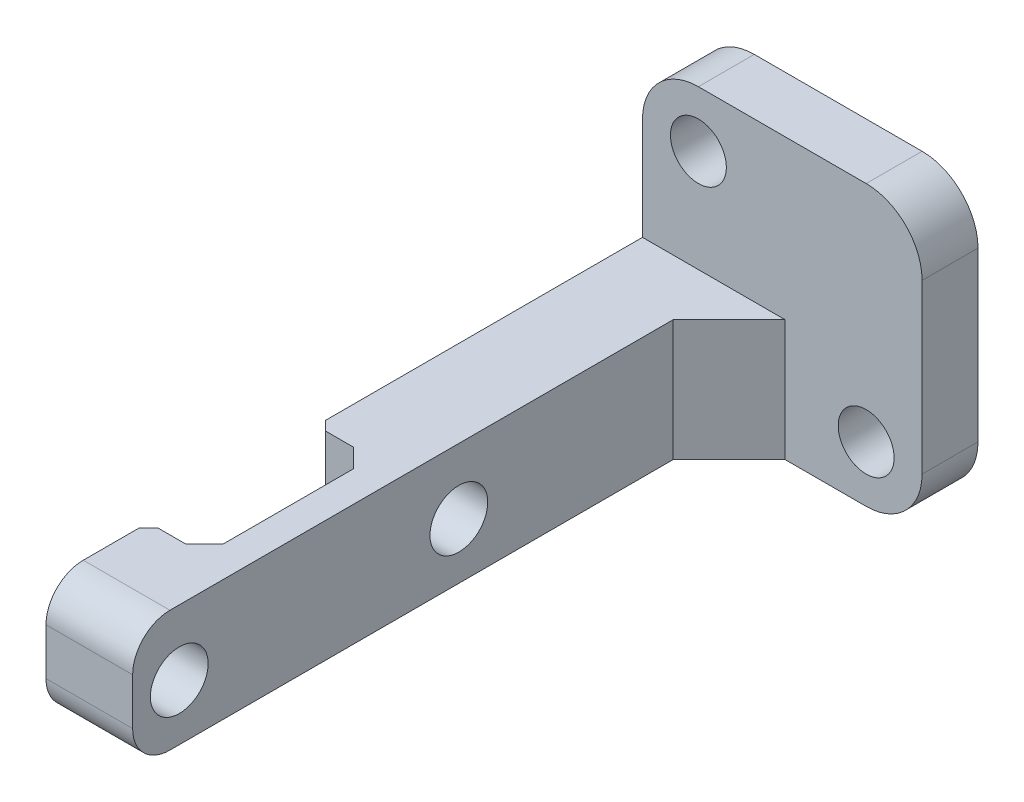
ISO-10303-21;
HEADER;
FILE_DESCRIPTION(('STEP AP214'),'2;1');
FILE_NAME('part.step','',(''),(''),'','','');
FILE_SCHEMA(('AUTOMOTIVE_DESIGN { 1 0 10303 214 1 1 1 1 }'));
ENDSEC;
DATA;
#1=APPLICATION_CONTEXT('core data for automotive mechanical design processes');
#2=APPLICATION_PROTOCOL_DEFINITION('international standard','automotive_design',2000,#1);
#3=PRODUCT_CONTEXT('',#1,'mechanical');
#4=PRODUCT('Part','Part','',(#3));
#5=PRODUCT_RELATED_PRODUCT_CATEGORY('part','',(#4));
#6=PRODUCT_DEFINITION_FORMATION('','',#4);
#7=PRODUCT_DEFINITION_CONTEXT('part definition',#1,'design');
#8=PRODUCT_DEFINITION('design','',#6,#7);
#9=PRODUCT_DEFINITION_SHAPE('','',#8);
#10=(LENGTH_UNIT() NAMED_UNIT(*) SI_UNIT(.MILLI.,.METRE.));
#11=(NAMED_UNIT(*) PLANE_ANGLE_UNIT() SI_UNIT($,.RADIAN.));
#12=(NAMED_UNIT(*) SI_UNIT($,.STERADIAN.) SOLID_ANGLE_UNIT());
#13=UNCERTAINTY_MEASURE_WITH_UNIT(LENGTH_MEASURE(1.E-05),#10,'distance_accuracy_value','');
#14=(GEOMETRIC_REPRESENTATION_CONTEXT(3) GLOBAL_UNCERTAINTY_ASSIGNED_CONTEXT((#13)) GLOBAL_UNIT_ASSIGNED_CONTEXT((#10,
#11,#12)) REPRESENTATION_CONTEXT('',''));
#15=CARTESIAN_POINT('',(0.,0.,0.));
#16=DIRECTION('',(0.,0.,1.));
#17=DIRECTION('',(1.,0.,0.));
#18=AXIS2_PLACEMENT_3D('',#15,#16,#17);
#19=CARTESIAN_POINT('',(9.64875729710002,0.,28.));
#20=DIRECTION('',(1.,0.,0.));
#21=DIRECTION('',(0.,0.,-1.));
#22=AXIS2_PLACEMENT_3D('',#19,#20,#21);
#23=PLANE('',#22);
#24=CARTESIAN_POINT('',(9.64875729710002,2.99999999999998,25.5));
#25=DIRECTION('',(1.,0.,0.));
#26=DIRECTION('',(0.,0.,-1.));
#27=AXIS2_PLACEMENT_3D('',#24,#25,#26);
#28=CIRCLE('',#27,1.55);
#29=CARTESIAN_POINT('',(9.64875729710002,2.99999999999998,23.95));
#30=VERTEX_POINT('',#29);
#31=EDGE_CURVE('E274',#30,#30,#28,.T.);
#32=ORIENTED_EDGE('',*,*,#31,.F.);
#33=EDGE_LOOP('',(#32));
#34=FACE_BOUND('',#33,.T.);
#35=CARTESIAN_POINT('',(9.64875729710002,2.99999999999998,10.5));
#36=DIRECTION('',(1.,0.,0.));
#37=DIRECTION('',(0.,0.,-1.));
#38=AXIS2_PLACEMENT_3D('',#35,#36,#37);
#39=CIRCLE('',#38,1.55);
#40=CARTESIAN_POINT('',(9.64875729710002,2.99999999999998,8.95));
#41=VERTEX_POINT('',#40);
#42=EDGE_CURVE('E278',#41,#41,#39,.T.);
#43=ORIENTED_EDGE('',*,*,#42,.F.);
#44=EDGE_LOOP('',(#43));
#45=FACE_BOUND('',#44,.T.);
#46=DIRECTION('',(0.,0.,-1.));
#47=VECTOR('',#46,1.);
#48=CARTESIAN_POINT('',(9.64875729710002,0.,28.));
#49=LINE('',#48,#47);
#50=CARTESIAN_POINT('',(9.64875729710002,0.,26.));
#51=VERTEX_POINT('',#50);
#52=CARTESIAN_POINT('',(9.64875729710002,0.,-0.99999999999999));
#53=VERTEX_POINT('',#52);
#54=EDGE_CURVE('E311',#51,#53,#49,.T.);
#55=ORIENTED_EDGE('',*,*,#54,.T.);
#56=DIRECTION('',(0.,1.,0.));
#57=VECTOR('',#56,1.);
#58=CARTESIAN_POINT('',(9.64875729710002,0.,-0.99999999999999));
#59=LINE('',#58,#57);
#60=CARTESIAN_POINT('',(9.64875729710002,6.5,-0.99999999999999));
#61=VERTEX_POINT('',#60);
#62=EDGE_CURVE('E303',#53,#61,#59,.T.);
#63=ORIENTED_EDGE('',*,*,#62,.T.);
#64=DIRECTION('',(0.,0.,-1.));
#65=VECTOR('',#64,1.);
#66=CARTESIAN_POINT('',(9.64875729710002,6.5,28.));
#67=LINE('',#66,#65);
#68=CARTESIAN_POINT('',(9.64875729710002,6.5,26.));
#69=VERTEX_POINT('',#68);
#70=EDGE_CURVE('E209',#69,#61,#67,.T.);
#71=ORIENTED_EDGE('',*,*,#70,.F.);
#72=CARTESIAN_POINT('',(9.64875729710002,4.5,26.));
#73=DIRECTION('',(1.,0.,0.));
#74=DIRECTION('',(0.,0.,-1.));
#75=AXIS2_PLACEMENT_3D('',#72,#73,#74);
#76=CIRCLE('',#75,2.);
#77=CARTESIAN_POINT('',(9.64875729710002,4.5,28.));
#78=VERTEX_POINT('',#77);
#79=EDGE_CURVE('E244',#69,#78,#76,.T.);
#80=ORIENTED_EDGE('',*,*,#79,.T.);
#81=DIRECTION('',(0.,-1.,0.));
#82=VECTOR('',#81,1.);
#83=CARTESIAN_POINT('',(9.64875729710002,0.,28.));
#84=LINE('',#83,#82);
#85=CARTESIAN_POINT('',(9.64875729710002,2.,28.));
#86=VERTEX_POINT('',#85);
#87=EDGE_CURVE('E322',#78,#86,#84,.T.);
#88=ORIENTED_EDGE('',*,*,#87,.T.);
#89=CARTESIAN_POINT('',(9.64875729710002,2.,26.));
#90=DIRECTION('',(1.,0.,0.));
#91=DIRECTION('',(0.,0.,-1.));
#92=AXIS2_PLACEMENT_3D('',#89,#90,#91);
#93=CIRCLE('',#92,2.);
#94=EDGE_CURVE('E242',#86,#51,#93,.T.);
#95=ORIENTED_EDGE('',*,*,#94,.T.);
#96=EDGE_LOOP('',(#55,#63,#71,#80,#88,#95));
#97=FACE_BOUND('',#96,.T.);
#98=ADVANCED_FACE('F38',(#34,#45,#97),#23,.T.);
#99=CARTESIAN_POINT('',(0.,6.5,28.));
#100=DIRECTION('',(0.,1.,0.));
#101=DIRECTION('',(0.,0.,1.));
#102=AXIS2_PLACEMENT_3D('',#99,#100,#101);
#103=PLANE('',#102);
#104=ORIENTED_EDGE('',*,*,#70,.T.);
#105=DIRECTION('',(0.707106781186543,0.,-0.707106781186552));
#106=VECTOR('',#105,1.);
#107=CARTESIAN_POINT('',(9.64875729710002,6.5,-0.99999999999999));
#108=LINE('',#107,#106);
#109=CARTESIAN_POINT('',(12.6487572971,6.5,-4.00000000000002));
#110=VERTEX_POINT('',#109);
#111=EDGE_CURVE('E47',#61,#110,#108,.T.);
#112=ORIENTED_EDGE('',*,*,#111,.T.);
#113=DIRECTION('',(-1.,0.,0.));
#114=VECTOR('',#113,1.);
#115=CARTESIAN_POINT('',(0.,6.5,-4.00000000000001));
#116=LINE('',#115,#114);
#117=CARTESIAN_POINT('',(5.,6.5,-4.00000000000002));
#118=VERTEX_POINT('',#117);
#119=EDGE_CURVE('E54',#110,#118,#116,.T.);
#120=ORIENTED_EDGE('',*,*,#119,.T.);
#121=DIRECTION('',(0.,0.,-1.));
#122=VECTOR('',#121,1.);
#123=CARTESIAN_POINT('',(5.,6.5,28.));
#124=LINE('',#123,#122);
#125=CARTESIAN_POINT('',(5.,6.5,13.));
#126=VERTEX_POINT('',#125);
#127=EDGE_CURVE('E195',#126,#118,#124,.T.);
#128=ORIENTED_EDGE('',*,*,#127,.F.);
#129=DIRECTION('',(-0.707106781186548,0.,-0.707106781186548));
#130=VECTOR('',#129,1.);
#131=CARTESIAN_POINT('',(10.,6.5,18.));
#132=LINE('',#131,#130);
#133=CARTESIAN_POINT('',(5.50000000000001,6.5,13.5));
#134=VERTEX_POINT('',#133);
#135=EDGE_CURVE('E266',#126,#134,#132,.F.);
#136=ORIENTED_EDGE('',*,*,#135,.T.);
#137=DIRECTION('',(-1.,0.,0.));
#138=VECTOR('',#137,1.);
#139=CARTESIAN_POINT('',(0.,6.5,13.5));
#140=LINE('',#139,#138);
#141=CARTESIAN_POINT('',(7.00000000000001,6.5,13.5));
#142=VERTEX_POINT('',#141);
#143=EDGE_CURVE('E332',#142,#134,#140,.T.);
#144=ORIENTED_EDGE('',*,*,#143,.F.);
#145=DIRECTION('',(-0.707106781186545,0.,-0.70710678118655));
#146=VECTOR('',#145,1.);
#147=CARTESIAN_POINT('',(8.00000000000001,6.5,14.5));
#148=LINE('',#147,#146);
#149=CARTESIAN_POINT('',(8.00000000000001,6.5,14.5));
#150=VERTEX_POINT('',#149);
#151=EDGE_CURVE('E232',#142,#150,#148,.F.);
#152=ORIENTED_EDGE('',*,*,#151,.T.);
#153=DIRECTION('',(0.,0.,-1.));
#154=VECTOR('',#153,1.);
#155=CARTESIAN_POINT('',(8.,6.5,28.));
#156=LINE('',#155,#154);
#157=CARTESIAN_POINT('',(8.00000000000001,6.5,21.5));
#158=VERTEX_POINT('',#157);
#159=EDGE_CURVE('E216',#158,#150,#156,.T.);
#160=ORIENTED_EDGE('',*,*,#159,.F.);
#161=DIRECTION('',(0.70710678118655,0.,-0.707106781186545));
#162=VECTOR('',#161,1.);
#163=CARTESIAN_POINT('',(7.,6.5,22.5));
#164=LINE('',#163,#162);
#165=CARTESIAN_POINT('',(7.,6.5,22.5));
#166=VERTEX_POINT('',#165);
#167=EDGE_CURVE('E236',#158,#166,#164,.F.);
#168=ORIENTED_EDGE('',*,*,#167,.T.);
#169=DIRECTION('',(1.,0.,0.));
#170=VECTOR('',#169,1.);
#171=CARTESIAN_POINT('',(0.,6.5,22.5));
#172=LINE('',#171,#170);
#173=CARTESIAN_POINT('',(5.50000000000001,6.5,22.5));
#174=VERTEX_POINT('',#173);
#175=EDGE_CURVE('E329',#174,#166,#172,.T.);
#176=ORIENTED_EDGE('',*,*,#175,.F.);
#177=DIRECTION('',(0.707106781186552,0.,-0.707106781186543));
#178=VECTOR('',#177,1.);
#179=CARTESIAN_POINT('',(0.,6.5,28.));
#180=LINE('',#179,#178);
#181=CARTESIAN_POINT('',(5.,6.5,23.));
#182=VERTEX_POINT('',#181);
#183=EDGE_CURVE('E268',#174,#182,#180,.F.);
#184=ORIENTED_EDGE('',*,*,#183,.T.);
#185=CARTESIAN_POINT('',(5.,6.5,26.));
#186=VERTEX_POINT('',#185);
#187=EDGE_CURVE('E205',#186,#182,#124,.T.);
#188=ORIENTED_EDGE('',*,*,#187,.F.);
#189=DIRECTION('',(1.,0.,0.));
#190=VECTOR('',#189,1.);
#191=CARTESIAN_POINT('',(0.,6.5,26.));
#192=LINE('',#191,#190);
#193=EDGE_CURVE('E239',#186,#69,#192,.T.);
#194=ORIENTED_EDGE('',*,*,#193,.T.);
#195=EDGE_LOOP('',(#104,#112,#120,#128,#136,#144,#152,#160,#168,#176,#184,#188,#194));
#196=FACE_BOUND('',#195,.T.);
#197=ADVANCED_FACE('F194',(#196),#103,.T.);
#198=CARTESIAN_POINT('',(5.,0.,28.));
#199=DIRECTION('',(1.,0.,0.));
#200=DIRECTION('',(0.,0.,-1.));
#201=AXIS2_PLACEMENT_3D('',#198,#199,#200);
#202=PLANE('',#201);
#203=CARTESIAN_POINT('',(5.,2.99999999999998,25.5));
#204=DIRECTION('',(-1.,0.,0.));
#205=DIRECTION('',(0.,0.,1.));
#206=AXIS2_PLACEMENT_3D('',#203,#204,#205);
#207=CIRCLE('',#206,1.55);
#208=CARTESIAN_POINT('',(5.,2.99999999999998,27.05));
#209=VERTEX_POINT('',#208);
#210=EDGE_CURVE('E349',#209,#209,#207,.T.);
#211=ORIENTED_EDGE('',*,*,#210,.F.);
#212=EDGE_LOOP('',(#211));
#213=FACE_BOUND('',#212,.T.);
#214=ORIENTED_EDGE('',*,*,#187,.T.);
#215=DIRECTION('',(0.,-1.,0.));
#216=VECTOR('',#215,1.);
#217=CARTESIAN_POINT('',(5.,0.,23.));
#218=LINE('',#217,#216);
#219=CARTESIAN_POINT('',(5.00000000000001,0.,23.));
#220=VERTEX_POINT('',#219);
#221=EDGE_CURVE('E257',#182,#220,#218,.T.);
#222=ORIENTED_EDGE('',*,*,#221,.T.);
#223=DIRECTION('',(0.,0.,-1.));
#224=VECTOR('',#223,1.);
#225=CARTESIAN_POINT('',(5.00000000000001,0.,28.));
#226=LINE('',#225,#224);
#227=CARTESIAN_POINT('',(5.00000000000001,0.,26.));
#228=VERTEX_POINT('',#227);
#229=EDGE_CURVE('E206',#228,#220,#226,.T.);
#230=ORIENTED_EDGE('',*,*,#229,.F.);
#231=CARTESIAN_POINT('',(5.,2.,26.));
#232=DIRECTION('',(1.,0.,0.));
#233=DIRECTION('',(0.,0.,-1.));
#234=AXIS2_PLACEMENT_3D('',#231,#232,#233);
#235=CIRCLE('',#234,2.);
#236=CARTESIAN_POINT('',(5.,2.,28.));
#237=VERTEX_POINT('',#236);
#238=EDGE_CURVE('E251',#228,#237,#235,.F.);
#239=ORIENTED_EDGE('',*,*,#238,.T.);
#240=DIRECTION('',(0.,-1.,0.));
#241=VECTOR('',#240,1.);
#242=CARTESIAN_POINT('',(5.,0.,28.));
#243=LINE('',#242,#241);
#244=CARTESIAN_POINT('',(5.,4.5,28.));
#245=VERTEX_POINT('',#244);
#246=EDGE_CURVE('E328',#245,#237,#243,.T.);
#247=ORIENTED_EDGE('',*,*,#246,.F.);
#248=CARTESIAN_POINT('',(5.,4.5,26.));
#249=DIRECTION('',(1.,0.,0.));
#250=DIRECTION('',(0.,0.,-1.));
#251=AXIS2_PLACEMENT_3D('',#248,#249,#250);
#252=CIRCLE('',#251,2.);
#253=EDGE_CURVE('E253',#245,#186,#252,.F.);
#254=ORIENTED_EDGE('',*,*,#253,.T.);
#255=EDGE_LOOP('',(#214,#222,#230,#239,#247,#254));
#256=FACE_BOUND('',#255,.T.);
#257=ADVANCED_FACE('F394',(#213,#256),#202,.F.);
#258=CARTESIAN_POINT('',(0.,0.,0.));
#259=DIRECTION('',(0.,-1.,0.));
#260=DIRECTION('',(0.,0.,-1.));
#261=AXIS2_PLACEMENT_3D('',#258,#259,#260);
#262=PLANE('',#261);
#263=DIRECTION('',(-1.,0.,0.));
#264=VECTOR('',#263,1.);
#265=CARTESIAN_POINT('',(9.64875729710003,0.,-7.00000000000002));
#266=LINE('',#265,#264);
#267=CARTESIAN_POINT('',(17.,0.,-7.00000000000002));
#268=VERTEX_POINT('',#267);
#269=CARTESIAN_POINT('',(5.,0.,-7.00000000000002));
#270=VERTEX_POINT('',#269);
#271=EDGE_CURVE('E196',#268,#270,#266,.T.);
#272=ORIENTED_EDGE('',*,*,#271,.F.);
#273=DIRECTION('',(0.,0.,-1.));
#274=VECTOR('',#273,1.);
#275=CARTESIAN_POINT('',(17.,0.,0.));
#276=LINE('',#275,#274);
#277=CARTESIAN_POINT('',(17.,0.,-4.00000000000002));
#278=VERTEX_POINT('',#277);
#279=EDGE_CURVE('E301',#268,#278,#276,.F.);
#280=ORIENTED_EDGE('',*,*,#279,.T.);
#281=DIRECTION('',(-1.,0.,0.));
#282=VECTOR('',#281,1.);
#283=CARTESIAN_POINT('',(5.,0.,-4.00000000000002));
#284=LINE('',#283,#282);
#285=CARTESIAN_POINT('',(12.6487572971,0.,-4.00000000000002));
#286=VERTEX_POINT('',#285);
#287=EDGE_CURVE('E197',#278,#286,#284,.T.);
#288=ORIENTED_EDGE('',*,*,#287,.T.);
#289=DIRECTION('',(-0.707106781186543,0.,0.707106781186552));
#290=VECTOR('',#289,1.);
#291=CARTESIAN_POINT('',(9.64875729710002,0.,-0.99999999999999));
#292=LINE('',#291,#290);
#293=EDGE_CURVE('E11',#286,#53,#292,.T.);
#294=ORIENTED_EDGE('',*,*,#293,.T.);
#295=ORIENTED_EDGE('',*,*,#54,.F.);
#296=DIRECTION('',(1.,0.,0.));
#297=VECTOR('',#296,1.);
#298=CARTESIAN_POINT('',(0.,0.,26.));
#299=LINE('',#298,#297);
#300=EDGE_CURVE('E255',#51,#228,#299,.F.);
#301=ORIENTED_EDGE('',*,*,#300,.T.);
#302=ORIENTED_EDGE('',*,*,#229,.T.);
#303=DIRECTION('',(-0.707106781186552,0.,0.707106781186543));
#304=VECTOR('',#303,1.);
#305=CARTESIAN_POINT('',(14.,0.,14.0000000000002));
#306=LINE('',#305,#304);
#307=CARTESIAN_POINT('',(5.50000000000001,0.,22.5));
#308=VERTEX_POINT('',#307);
#309=EDGE_CURVE('E262',#220,#308,#306,.F.);
#310=ORIENTED_EDGE('',*,*,#309,.T.);
#311=DIRECTION('',(-1.,0.,0.));
#312=VECTOR('',#311,1.);
#313=CARTESIAN_POINT('',(5.00000000000001,0.,22.5));
#314=LINE('',#313,#312);
#315=CARTESIAN_POINT('',(7.,0.,22.5));
#316=VERTEX_POINT('',#315);
#317=EDGE_CURVE('E361',#316,#308,#314,.T.);
#318=ORIENTED_EDGE('',*,*,#317,.F.);
#319=DIRECTION('',(-0.70710678118655,0.,0.707106781186545));
#320=VECTOR('',#319,1.);
#321=CARTESIAN_POINT('',(7.,0.,22.5));
#322=LINE('',#321,#320);
#323=CARTESIAN_POINT('',(8.00000000000001,0.,21.5));
#324=VERTEX_POINT('',#323);
#325=EDGE_CURVE('E234',#316,#324,#322,.F.);
#326=ORIENTED_EDGE('',*,*,#325,.T.);
#327=DIRECTION('',(0.,0.,1.));
#328=VECTOR('',#327,1.);
#329=CARTESIAN_POINT('',(8.00000000000001,0.,22.5));
#330=LINE('',#329,#328);
#331=CARTESIAN_POINT('',(8.00000000000001,0.,14.5));
#332=VERTEX_POINT('',#331);
#333=EDGE_CURVE('E358',#332,#324,#330,.T.);
#334=ORIENTED_EDGE('',*,*,#333,.F.);
#335=DIRECTION('',(0.707106781186545,0.,0.70710678118655));
#336=VECTOR('',#335,1.);
#337=CARTESIAN_POINT('',(8.00000000000001,0.,14.5));
#338=LINE('',#337,#336);
#339=CARTESIAN_POINT('',(7.00000000000001,0.,13.5));
#340=VERTEX_POINT('',#339);
#341=EDGE_CURVE('E229',#332,#340,#338,.F.);
#342=ORIENTED_EDGE('',*,*,#341,.T.);
#343=DIRECTION('',(1.,0.,0.));
#344=VECTOR('',#343,1.);
#345=CARTESIAN_POINT('',(5.00000000000001,0.,13.5));
#346=LINE('',#345,#344);
#347=CARTESIAN_POINT('',(5.50000000000001,0.,13.5));
#348=VERTEX_POINT('',#347);
#349=EDGE_CURVE('E277',#348,#340,#346,.T.);
#350=ORIENTED_EDGE('',*,*,#349,.F.);
#351=DIRECTION('',(0.707106781186548,0.,0.707106781186548));
#352=VECTOR('',#351,1.);
#353=CARTESIAN_POINT('',(-4.,0.,4.));
#354=LINE('',#353,#352);
#355=CARTESIAN_POINT('',(5.00000000000001,0.,13.));
#356=VERTEX_POINT('',#355);
#357=EDGE_CURVE('E260',#348,#356,#354,.F.);
#358=ORIENTED_EDGE('',*,*,#357,.T.);
#359=EDGE_CURVE('E211',#356,#270,#226,.T.);
#360=ORIENTED_EDGE('',*,*,#359,.T.);
#361=EDGE_LOOP('',(#272,#280,#288,#294,#295,#301,#302,#310,#318,#326,#334,#342,#350,#358,#360));
#362=FACE_BOUND('',#361,.T.);
#363=ADVANCED_FACE('F339',(#362),#262,.T.);
#364=DIRECTION('',(0.,1.,0.));
#365=VECTOR('',#364,1.);
#366=CARTESIAN_POINT('',(5.,0.,-4.00000000000002));
#367=LINE('',#366,#365);
#368=CARTESIAN_POINT('',(5.,12.,-4.00000000000002));
#369=VERTEX_POINT('',#368);
#370=EDGE_CURVE('E179',#118,#369,#367,.T.);
#371=ORIENTED_EDGE('',*,*,#370,.T.);
#372=DIRECTION('',(0.,0.,-1.));
#373=VECTOR('',#372,1.);
#374=CARTESIAN_POINT('',(5.,12.,-7.00000000000002));
#375=LINE('',#374,#373);
#376=CARTESIAN_POINT('',(5.,12.,-7.00000000000002));
#377=VERTEX_POINT('',#376);
#378=EDGE_CURVE('E273',#369,#377,#375,.T.);
#379=ORIENTED_EDGE('',*,*,#378,.T.);
#380=DIRECTION('',(0.,1.,0.));
#381=VECTOR('',#380,1.);
#382=CARTESIAN_POINT('',(5.,0.,-7.00000000000002));
#383=LINE('',#382,#381);
#384=EDGE_CURVE('E344',#270,#377,#383,.T.);
#385=ORIENTED_EDGE('',*,*,#384,.F.);
#386=ORIENTED_EDGE('',*,*,#359,.F.);
#387=DIRECTION('',(0.,1.,0.));
#388=VECTOR('',#387,1.);
#389=CARTESIAN_POINT('',(5.,0.,13.));
#390=LINE('',#389,#388);
#391=EDGE_CURVE('E204',#356,#126,#390,.T.);
#392=ORIENTED_EDGE('',*,*,#391,.T.);
#393=ORIENTED_EDGE('',*,*,#127,.T.);
#394=EDGE_LOOP('',(#371,#379,#385,#386,#392,#393));
#395=FACE_BOUND('',#394,.T.);
#396=CARTESIAN_POINT('',(5.,2.99999999999998,10.5));
#397=DIRECTION('',(-1.,0.,0.));
#398=DIRECTION('',(0.,0.,1.));
#399=AXIS2_PLACEMENT_3D('',#396,#397,#398);
#400=CIRCLE('',#399,1.55);
#401=CARTESIAN_POINT('',(5.,2.99999999999998,12.05));
#402=VERTEX_POINT('',#401);
#403=EDGE_CURVE('E346',#402,#402,#400,.T.);
#404=ORIENTED_EDGE('',*,*,#403,.F.);
#405=EDGE_LOOP('',(#404));
#406=FACE_BOUND('',#405,.T.);
#407=ADVANCED_FACE('F200',(#395,#406),#202,.F.);
#408=CARTESIAN_POINT('',(0.,0.,28.));
#409=DIRECTION('',(0.,0.,1.));
#410=DIRECTION('',(1.,0.,0.));
#411=AXIS2_PLACEMENT_3D('',#408,#409,#410);
#412=PLANE('',#411);
#413=ORIENTED_EDGE('',*,*,#87,.F.);
#414=DIRECTION('',(1.,0.,0.));
#415=VECTOR('',#414,1.);
#416=CARTESIAN_POINT('',(0.,4.5,28.));
#417=LINE('',#416,#415);
#418=EDGE_CURVE('E249',#78,#245,#417,.F.);
#419=ORIENTED_EDGE('',*,*,#418,.T.);
#420=ORIENTED_EDGE('',*,*,#246,.T.);
#421=DIRECTION('',(1.,0.,0.));
#422=VECTOR('',#421,1.);
#423=CARTESIAN_POINT('',(0.,2.,28.));
#424=LINE('',#423,#422);
#425=EDGE_CURVE('E246',#237,#86,#424,.T.);
#426=ORIENTED_EDGE('',*,*,#425,.T.);
#427=EDGE_LOOP('',(#413,#419,#420,#426));
#428=FACE_BOUND('',#427,.T.);
#429=ADVANCED_FACE('F324',(#428),#412,.T.);
#430=CARTESIAN_POINT('',(5.00000000000001,12.8,22.5));
#431=DIRECTION('',(0.,0.,1.));
#432=DIRECTION('',(1.,0.,0.));
#433=AXIS2_PLACEMENT_3D('',#430,#431,#432);
#434=PLANE('',#433);
#435=ORIENTED_EDGE('',*,*,#317,.T.);
#436=DIRECTION('',(0.,1.,0.));
#437=VECTOR('',#436,1.);
#438=CARTESIAN_POINT('',(5.50000000000001,12.8,22.5));
#439=LINE('',#438,#437);
#440=EDGE_CURVE('E264',#308,#174,#439,.T.);
#441=ORIENTED_EDGE('',*,*,#440,.T.);
#442=ORIENTED_EDGE('',*,*,#175,.T.);
#443=DIRECTION('',(0.,-1.,0.));
#444=VECTOR('',#443,1.);
#445=CARTESIAN_POINT('',(7.,0.,22.5));
#446=LINE('',#445,#444);
#447=EDGE_CURVE('E226',#166,#316,#446,.T.);
#448=ORIENTED_EDGE('',*,*,#447,.T.);
#449=EDGE_LOOP('',(#435,#441,#442,#448));
#450=FACE_BOUND('',#449,.T.);
#451=ADVANCED_FACE('F513',(#450),#434,.F.);
#452=CARTESIAN_POINT('',(8.00000000000001,12.8,22.5));
#453=DIRECTION('',(1.,0.,0.));
#454=DIRECTION('',(0.,0.,-1.));
#455=AXIS2_PLACEMENT_3D('',#452,#453,#454);
#456=PLANE('',#455);
#457=ORIENTED_EDGE('',*,*,#159,.T.);
#458=DIRECTION('',(0.,-1.,0.));
#459=VECTOR('',#458,1.);
#460=CARTESIAN_POINT('',(8.00000000000001,0.,14.5));
#461=LINE('',#460,#459);
#462=EDGE_CURVE('E221',#150,#332,#461,.T.);
#463=ORIENTED_EDGE('',*,*,#462,.T.);
#464=ORIENTED_EDGE('',*,*,#333,.T.);
#465=DIRECTION('',(0.,1.,0.));
#466=VECTOR('',#465,1.);
#467=CARTESIAN_POINT('',(8.00000000000001,6.5,21.5));
#468=LINE('',#467,#466);
#469=EDGE_CURVE('E219',#324,#158,#468,.T.);
#470=ORIENTED_EDGE('',*,*,#469,.T.);
#471=EDGE_LOOP('',(#457,#463,#464,#470));
#472=FACE_BOUND('',#471,.T.);
#473=ADVANCED_FACE('F516',(#472),#456,.F.);
#474=CARTESIAN_POINT('',(5.00000000000001,12.8,13.5));
#475=DIRECTION('',(0.,0.,-1.));
#476=DIRECTION('',(-1.,0.,0.));
#477=AXIS2_PLACEMENT_3D('',#474,#475,#476);
#478=PLANE('',#477);
#479=ORIENTED_EDGE('',*,*,#143,.T.);
#480=DIRECTION('',(0.,-1.,0.));
#481=VECTOR('',#480,1.);
#482=CARTESIAN_POINT('',(5.50000000000001,12.8,13.5));
#483=LINE('',#482,#481);
#484=EDGE_CURVE('E271',#134,#348,#483,.T.);
#485=ORIENTED_EDGE('',*,*,#484,.T.);
#486=ORIENTED_EDGE('',*,*,#349,.T.);
#487=DIRECTION('',(0.,1.,0.));
#488=VECTOR('',#487,1.);
#489=CARTESIAN_POINT('',(7.00000000000001,6.5,13.5));
#490=LINE('',#489,#488);
#491=EDGE_CURVE('E224',#340,#142,#490,.T.);
#492=ORIENTED_EDGE('',*,*,#491,.T.);
#493=EDGE_LOOP('',(#479,#485,#486,#492));
#494=FACE_BOUND('',#493,.T.);
#495=ADVANCED_FACE('F367',(#494),#478,.F.);
#496=CARTESIAN_POINT('',(8.00000000000001,12.8,14.5));
#497=DIRECTION('',(-0.70710678118655,0.,0.707106781186545));
#498=DIRECTION('',(0.,1.,0.));
#499=AXIS2_PLACEMENT_3D('',#496,#497,#498);
#500=PLANE('',#499);
#501=ORIENTED_EDGE('',*,*,#151,.F.);
#502=ORIENTED_EDGE('',*,*,#491,.F.);
#503=ORIENTED_EDGE('',*,*,#341,.F.);
#504=ORIENTED_EDGE('',*,*,#462,.F.);
#505=EDGE_LOOP('',(#501,#502,#503,#504));
#506=FACE_BOUND('',#505,.T.);
#507=ADVANCED_FACE('F403',(#506),#500,.T.);
#508=CARTESIAN_POINT('',(7.,12.8,22.5));
#509=DIRECTION('',(-0.707106781186545,0.,-0.70710678118655));
#510=DIRECTION('',(0.,1.,0.));
#511=AXIS2_PLACEMENT_3D('',#508,#509,#510);
#512=PLANE('',#511);
#513=ORIENTED_EDGE('',*,*,#167,.F.);
#514=ORIENTED_EDGE('',*,*,#469,.F.);
#515=ORIENTED_EDGE('',*,*,#325,.F.);
#516=ORIENTED_EDGE('',*,*,#447,.F.);
#517=EDGE_LOOP('',(#513,#514,#515,#516));
#518=FACE_BOUND('',#517,.T.);
#519=ADVANCED_FACE('F409',(#518),#512,.T.);
#520=CARTESIAN_POINT('',(0.,4.5,26.));
#521=DIRECTION('',(1.,0.,0.));
#522=DIRECTION('',(0.,0.,-1.));
#523=AXIS2_PLACEMENT_3D('',#520,#521,#522);
#524=CYLINDRICAL_SURFACE('',#523,2.);
#525=ORIENTED_EDGE('',*,*,#253,.F.);
#526=ORIENTED_EDGE('',*,*,#418,.F.);
#527=ORIENTED_EDGE('',*,*,#79,.F.);
#528=ORIENTED_EDGE('',*,*,#193,.F.);
#529=EDGE_LOOP('',(#525,#526,#527,#528));
#530=FACE_BOUND('',#529,.T.);
#531=ADVANCED_FACE('F318',(#530),#524,.T.);
#532=CARTESIAN_POINT('',(0.,2.,26.));
#533=DIRECTION('',(1.,0.,0.));
#534=DIRECTION('',(0.,0.,-1.));
#535=AXIS2_PLACEMENT_3D('',#532,#533,#534);
#536=CYLINDRICAL_SURFACE('',#535,2.);
#537=ORIENTED_EDGE('',*,*,#238,.F.);
#538=ORIENTED_EDGE('',*,*,#300,.F.);
#539=ORIENTED_EDGE('',*,*,#94,.F.);
#540=ORIENTED_EDGE('',*,*,#425,.F.);
#541=EDGE_LOOP('',(#537,#538,#539,#540));
#542=FACE_BOUND('',#541,.T.);
#543=ADVANCED_FACE('F383',(#542),#536,.T.);
#544=CARTESIAN_POINT('',(5.,0.,23.));
#545=DIRECTION('',(0.707106781186542,0.,0.707106781186552));
#546=DIRECTION('',(0.,-1.,0.));
#547=AXIS2_PLACEMENT_3D('',#544,#545,#546);
#548=PLANE('',#547);
#549=ORIENTED_EDGE('',*,*,#183,.F.);
#550=ORIENTED_EDGE('',*,*,#440,.F.);
#551=ORIENTED_EDGE('',*,*,#309,.F.);
#552=ORIENTED_EDGE('',*,*,#221,.F.);
#553=EDGE_LOOP('',(#549,#550,#551,#552));
#554=FACE_BOUND('',#553,.T.);
#555=ADVANCED_FACE('F374',(#554),#548,.F.);
#556=CARTESIAN_POINT('',(5.,0.,13.));
#557=DIRECTION('',(0.707106781186547,0.,-0.707106781186547));
#558=DIRECTION('',(0.,1.,0.));
#559=AXIS2_PLACEMENT_3D('',#556,#557,#558);
#560=PLANE('',#559);
#561=ORIENTED_EDGE('',*,*,#357,.F.);
#562=ORIENTED_EDGE('',*,*,#484,.F.);
#563=ORIENTED_EDGE('',*,*,#135,.F.);
#564=ORIENTED_EDGE('',*,*,#391,.F.);
#565=EDGE_LOOP('',(#561,#562,#563,#564));
#566=FACE_BOUND('',#565,.T.);
#567=ADVANCED_FACE('F371',(#566),#560,.F.);
#568=CARTESIAN_POINT('',(17.8,2.99999999999998,10.5));
#569=DIRECTION('',(-1.,0.,0.));
#570=DIRECTION('',(0.,0.,1.));
#571=AXIS2_PLACEMENT_3D('',#568,#569,#570);
#572=CYLINDRICAL_SURFACE('',#571,1.55);
#573=ORIENTED_EDGE('',*,*,#42,.T.);
#574=EDGE_LOOP('',(#573));
#575=FACE_BOUND('',#574,.T.);
#576=ORIENTED_EDGE('',*,*,#403,.T.);
#577=EDGE_LOOP('',(#576));
#578=FACE_BOUND('',#577,.T.);
#579=ADVANCED_FACE('F373',(#575,#578),#572,.F.);
#580=CARTESIAN_POINT('',(17.8,2.99999999999998,25.5));
#581=DIRECTION('',(-1.,0.,0.));
#582=DIRECTION('',(0.,0.,1.));
#583=AXIS2_PLACEMENT_3D('',#580,#581,#582);
#584=CYLINDRICAL_SURFACE('',#583,1.55);
#585=ORIENTED_EDGE('',*,*,#31,.T.);
#586=EDGE_LOOP('',(#585));
#587=FACE_BOUND('',#586,.T.);
#588=ORIENTED_EDGE('',*,*,#210,.T.);
#589=EDGE_LOOP('',(#588));
#590=FACE_BOUND('',#589,.T.);
#591=ADVANCED_FACE('F380',(#587,#590),#584,.F.);
#592=CARTESIAN_POINT('',(0.,0.,-7.00000000000002));
#593=DIRECTION('',(0.,0.,-1.));
#594=DIRECTION('',(-1.,0.,0.));
#595=AXIS2_PLACEMENT_3D('',#592,#593,#594);
#596=PLANE('',#595);
#597=CARTESIAN_POINT('',(17.,3.,-7.00000000000002));
#598=DIRECTION('',(0.,0.,-1.));
#599=DIRECTION('',(-1.,0.,0.));
#600=AXIS2_PLACEMENT_3D('',#597,#598,#599);
#601=CIRCLE('',#600,1.5);
#602=CARTESIAN_POINT('',(15.5,3.,-7.00000000000002));
#603=VERTEX_POINT('',#602);
#604=EDGE_CURVE('E467',#603,#603,#601,.T.);
#605=ORIENTED_EDGE('',*,*,#604,.F.);
#606=EDGE_LOOP('',(#605));
#607=FACE_BOUND('',#606,.T.);
#608=CARTESIAN_POINT('',(8.,12.,-7.00000000000002));
#609=DIRECTION('',(0.,0.,-1.));
#610=DIRECTION('',(-1.,0.,0.));
#611=AXIS2_PLACEMENT_3D('',#608,#609,#610);
#612=CIRCLE('',#611,1.5);
#613=CARTESIAN_POINT('',(6.5,12.,-7.00000000000002));
#614=VERTEX_POINT('',#613);
#615=EDGE_CURVE('E472',#614,#614,#612,.T.);
#616=ORIENTED_EDGE('',*,*,#615,.F.);
#617=EDGE_LOOP('',(#616));
#618=FACE_BOUND('',#617,.T.);
#619=ORIENTED_EDGE('',*,*,#384,.T.);
#620=CARTESIAN_POINT('',(8.,12.,-7.00000000000002));
#621=DIRECTION('',(0.,0.,-1.));
#622=DIRECTION('',(-1.,0.,0.));
#623=AXIS2_PLACEMENT_3D('',#620,#621,#622);
#624=CIRCLE('',#623,3.);
#625=CARTESIAN_POINT('',(8.,15.,-7.00000000000002));
#626=VERTEX_POINT('',#625);
#627=EDGE_CURVE('E284',#377,#626,#624,.T.);
#628=ORIENTED_EDGE('',*,*,#627,.T.);
#629=DIRECTION('',(1.,0.,0.));
#630=VECTOR('',#629,1.);
#631=CARTESIAN_POINT('',(5.,15.,-7.00000000000002));
#632=LINE('',#631,#630);
#633=CARTESIAN_POINT('',(17.,15.,-7.00000000000002));
#634=VERTEX_POINT('',#633);
#635=EDGE_CURVE('E462',#626,#634,#632,.T.);
#636=ORIENTED_EDGE('',*,*,#635,.T.);
#637=CARTESIAN_POINT('',(17.,12.,-7.00000000000002));
#638=DIRECTION('',(0.,0.,-1.));
#639=DIRECTION('',(-1.,0.,0.));
#640=AXIS2_PLACEMENT_3D('',#637,#638,#639);
#641=CIRCLE('',#640,3.);
#642=CARTESIAN_POINT('',(20.,12.,-7.00000000000002));
#643=VERTEX_POINT('',#642);
#644=EDGE_CURVE('E282',#634,#643,#641,.T.);
#645=ORIENTED_EDGE('',*,*,#644,.T.);
#646=DIRECTION('',(0.,-1.,0.));
#647=VECTOR('',#646,1.);
#648=CARTESIAN_POINT('',(20.,0.,-7.00000000000002));
#649=LINE('',#648,#647);
#650=CARTESIAN_POINT('',(20.,3.,-7.00000000000002));
#651=VERTEX_POINT('',#650);
#652=EDGE_CURVE('E189',#643,#651,#649,.T.);
#653=ORIENTED_EDGE('',*,*,#652,.T.);
#654=CARTESIAN_POINT('',(17.,3.,-7.00000000000002));
#655=DIRECTION('',(0.,0.,-1.));
#656=DIRECTION('',(-1.,0.,0.));
#657=AXIS2_PLACEMENT_3D('',#654,#655,#656);
#658=CIRCLE('',#657,3.);
#659=EDGE_CURVE('E280',#651,#268,#658,.T.);
#660=ORIENTED_EDGE('',*,*,#659,.T.);
#661=ORIENTED_EDGE('',*,*,#271,.T.);
#662=EDGE_LOOP('',(#619,#628,#636,#645,#653,#660,#661));
#663=FACE_BOUND('',#662,.T.);
#664=ADVANCED_FACE('F461',(#607,#618,#663),#596,.T.);
#665=CARTESIAN_POINT('',(20.,0.,-4.00000000000002));
#666=DIRECTION('',(1.,0.,0.));
#667=DIRECTION('',(0.,0.,-1.));
#668=AXIS2_PLACEMENT_3D('',#665,#666,#667);
#669=PLANE('',#668);
#670=ORIENTED_EDGE('',*,*,#652,.F.);
#671=DIRECTION('',(0.,0.,-1.));
#672=VECTOR('',#671,1.);
#673=CARTESIAN_POINT('',(20.,12.,-4.00000000000002));
#674=LINE('',#673,#672);
#675=CARTESIAN_POINT('',(20.,12.,-4.00000000000002));
#676=VERTEX_POINT('',#675);
#677=EDGE_CURVE('E299',#643,#676,#674,.F.);
#678=ORIENTED_EDGE('',*,*,#677,.T.);
#679=DIRECTION('',(0.,-1.,0.));
#680=VECTOR('',#679,1.);
#681=CARTESIAN_POINT('',(20.,0.,-4.00000000000002));
#682=LINE('',#681,#680);
#683=CARTESIAN_POINT('',(20.,3.,-4.00000000000002));
#684=VERTEX_POINT('',#683);
#685=EDGE_CURVE('E476',#676,#684,#682,.T.);
#686=ORIENTED_EDGE('',*,*,#685,.T.);
#687=DIRECTION('',(0.,0.,-1.));
#688=VECTOR('',#687,1.);
#689=CARTESIAN_POINT('',(20.,3.,-4.00000000000002));
#690=LINE('',#689,#688);
#691=EDGE_CURVE('E296',#684,#651,#690,.T.);
#692=ORIENTED_EDGE('',*,*,#691,.T.);
#693=EDGE_LOOP('',(#670,#678,#686,#692));
#694=FACE_BOUND('',#693,.T.);
#695=ADVANCED_FACE('F501',(#694),#669,.T.);
#696=CARTESIAN_POINT('',(5.,15.,-4.00000000000002));
#697=DIRECTION('',(0.,1.,0.));
#698=DIRECTION('',(-1.,0.,0.));
#699=AXIS2_PLACEMENT_3D('',#696,#697,#698);
#700=PLANE('',#699);
#701=ORIENTED_EDGE('',*,*,#635,.F.);
#702=DIRECTION('',(0.,0.,-1.));
#703=VECTOR('',#702,1.);
#704=CARTESIAN_POINT('',(8.,15.,-4.00000000000001));
#705=LINE('',#704,#703);
#706=CARTESIAN_POINT('',(8.,15.,-4.00000000000002));
#707=VERTEX_POINT('',#706);
#708=EDGE_CURVE('E289',#626,#707,#705,.F.);
#709=ORIENTED_EDGE('',*,*,#708,.T.);
#710=DIRECTION('',(1.,0.,0.));
#711=VECTOR('',#710,1.);
#712=CARTESIAN_POINT('',(5.,15.,-4.00000000000002));
#713=LINE('',#712,#711);
#714=CARTESIAN_POINT('',(17.,15.,-4.00000000000002));
#715=VERTEX_POINT('',#714);
#716=EDGE_CURVE('E188',#707,#715,#713,.T.);
#717=ORIENTED_EDGE('',*,*,#716,.T.);
#718=DIRECTION('',(0.,0.,-1.));
#719=VECTOR('',#718,1.);
#720=CARTESIAN_POINT('',(17.,15.,-4.00000000000002));
#721=LINE('',#720,#719);
#722=EDGE_CURVE('E286',#715,#634,#721,.T.);
#723=ORIENTED_EDGE('',*,*,#722,.T.);
#724=EDGE_LOOP('',(#701,#709,#717,#723));
#725=FACE_BOUND('',#724,.T.);
#726=ADVANCED_FACE('F464',(#725),#700,.T.);
#727=CARTESIAN_POINT('',(0.,0.,-4.00000000000002));
#728=DIRECTION('',(0.,0.,-1.));
#729=DIRECTION('',(-1.,0.,0.));
#730=AXIS2_PLACEMENT_3D('',#727,#728,#729);
#731=PLANE('',#730);
#732=CARTESIAN_POINT('',(17.,3.,-4.00000000000002));
#733=DIRECTION('',(0.,0.,1.));
#734=DIRECTION('',(1.,0.,0.));
#735=AXIS2_PLACEMENT_3D('',#732,#733,#734);
#736=CIRCLE('',#735,1.5);
#737=CARTESIAN_POINT('',(18.5,3.,-4.00000000000002));
#738=VERTEX_POINT('',#737);
#739=EDGE_CURVE('E482',#738,#738,#736,.T.);
#740=ORIENTED_EDGE('',*,*,#739,.F.);
#741=EDGE_LOOP('',(#740));
#742=FACE_BOUND('',#741,.T.);
#743=CARTESIAN_POINT('',(8.,12.,-4.00000000000002));
#744=DIRECTION('',(0.,0.,1.));
#745=DIRECTION('',(1.,0.,0.));
#746=AXIS2_PLACEMENT_3D('',#743,#744,#745);
#747=CIRCLE('',#746,1.5);
#748=CARTESIAN_POINT('',(9.50000000000001,12.,-4.00000000000002));
#749=VERTEX_POINT('',#748);
#750=EDGE_CURVE('E483',#749,#749,#747,.T.);
#751=ORIENTED_EDGE('',*,*,#750,.F.);
#752=EDGE_LOOP('',(#751));
#753=FACE_BOUND('',#752,.T.);
#754=ORIENTED_EDGE('',*,*,#119,.F.);
#755=DIRECTION('',(0.,-1.,0.));
#756=VECTOR('',#755,1.);
#757=CARTESIAN_POINT('',(12.6487572971,0.,-4.00000000000002));
#758=LINE('',#757,#756);
#759=EDGE_CURVE('E59',#110,#286,#758,.T.);
#760=ORIENTED_EDGE('',*,*,#759,.T.);
#761=ORIENTED_EDGE('',*,*,#287,.F.);
#762=CARTESIAN_POINT('',(17.,3.,-4.00000000000002));
#763=DIRECTION('',(0.,0.,-1.));
#764=DIRECTION('',(-1.,0.,0.));
#765=AXIS2_PLACEMENT_3D('',#762,#763,#764);
#766=CIRCLE('',#765,3.);
#767=EDGE_CURVE('E291',#278,#684,#766,.F.);
#768=ORIENTED_EDGE('',*,*,#767,.T.);
#769=ORIENTED_EDGE('',*,*,#685,.F.);
#770=CARTESIAN_POINT('',(17.,12.,-4.00000000000002));
#771=DIRECTION('',(0.,0.,-1.));
#772=DIRECTION('',(-1.,0.,0.));
#773=AXIS2_PLACEMENT_3D('',#770,#771,#772);
#774=CIRCLE('',#773,3.);
#775=EDGE_CURVE('E293',#676,#715,#774,.F.);
#776=ORIENTED_EDGE('',*,*,#775,.T.);
#777=ORIENTED_EDGE('',*,*,#716,.F.);
#778=CARTESIAN_POINT('',(8.,12.,-4.00000000000001));
#779=DIRECTION('',(0.,0.,-1.));
#780=DIRECTION('',(-1.,0.,0.));
#781=AXIS2_PLACEMENT_3D('',#778,#779,#780);
#782=CIRCLE('',#781,3.);
#783=EDGE_CURVE('E183',#707,#369,#782,.F.);
#784=ORIENTED_EDGE('',*,*,#783,.T.);
#785=ORIENTED_EDGE('',*,*,#370,.F.);
#786=EDGE_LOOP('',(#754,#760,#761,#768,#769,#776,#777,#784,#785));
#787=FACE_BOUND('',#786,.T.);
#788=ADVANCED_FACE('F180',(#742,#753,#787),#731,.F.);
#789=CARTESIAN_POINT('',(8.,12.,-9.00000000000002));
#790=DIRECTION('',(0.,0.,1.));
#791=DIRECTION('',(1.,0.,0.));
#792=AXIS2_PLACEMENT_3D('',#789,#790,#791);
#793=CYLINDRICAL_SURFACE('',#792,1.5);
#794=ORIENTED_EDGE('',*,*,#615,.T.);
#795=EDGE_LOOP('',(#794));
#796=FACE_BOUND('',#795,.T.);
#797=ORIENTED_EDGE('',*,*,#750,.T.);
#798=EDGE_LOOP('',(#797));
#799=FACE_BOUND('',#798,.T.);
#800=ADVANCED_FACE('F455',(#796,#799),#793,.F.);
#801=CARTESIAN_POINT('',(17.,3.,-9.00000000000002));
#802=DIRECTION('',(0.,0.,1.));
#803=DIRECTION('',(1.,0.,0.));
#804=AXIS2_PLACEMENT_3D('',#801,#802,#803);
#805=CYLINDRICAL_SURFACE('',#804,1.5);
#806=ORIENTED_EDGE('',*,*,#604,.T.);
#807=EDGE_LOOP('',(#806));
#808=FACE_BOUND('',#807,.T.);
#809=ORIENTED_EDGE('',*,*,#739,.T.);
#810=EDGE_LOOP('',(#809));
#811=FACE_BOUND('',#810,.T.);
#812=ADVANCED_FACE('F450',(#808,#811),#805,.F.);
#813=CARTESIAN_POINT('',(8.,12.,28.));
#814=DIRECTION('',(0.,0.,1.));
#815=DIRECTION('',(1.,0.,0.));
#816=AXIS2_PLACEMENT_3D('',#813,#814,#815);
#817=CYLINDRICAL_SURFACE('',#816,3.);
#818=ORIENTED_EDGE('',*,*,#783,.F.);
#819=ORIENTED_EDGE('',*,*,#708,.F.);
#820=ORIENTED_EDGE('',*,*,#627,.F.);
#821=ORIENTED_EDGE('',*,*,#378,.F.);
#822=EDGE_LOOP('',(#818,#819,#820,#821));
#823=FACE_BOUND('',#822,.T.);
#824=ADVANCED_FACE('F445',(#823),#817,.T.);
#825=CARTESIAN_POINT('',(17.,12.,-4.00000000000002));
#826=DIRECTION('',(0.,0.,-1.));
#827=DIRECTION('',(-1.,0.,0.));
#828=AXIS2_PLACEMENT_3D('',#825,#826,#827);
#829=CYLINDRICAL_SURFACE('',#828,3.);
#830=ORIENTED_EDGE('',*,*,#775,.F.);
#831=ORIENTED_EDGE('',*,*,#677,.F.);
#832=ORIENTED_EDGE('',*,*,#644,.F.);
#833=ORIENTED_EDGE('',*,*,#722,.F.);
#834=EDGE_LOOP('',(#830,#831,#832,#833));
#835=FACE_BOUND('',#834,.T.);
#836=ADVANCED_FACE('F440',(#835),#829,.T.);
#837=CARTESIAN_POINT('',(17.,3.,-4.00000000000002));
#838=DIRECTION('',(0.,0.,-1.));
#839=DIRECTION('',(-1.,0.,0.));
#840=AXIS2_PLACEMENT_3D('',#837,#838,#839);
#841=CYLINDRICAL_SURFACE('',#840,3.);
#842=ORIENTED_EDGE('',*,*,#767,.F.);
#843=ORIENTED_EDGE('',*,*,#279,.F.);
#844=ORIENTED_EDGE('',*,*,#659,.F.);
#845=ORIENTED_EDGE('',*,*,#691,.F.);
#846=EDGE_LOOP('',(#842,#843,#844,#845));
#847=FACE_BOUND('',#846,.T.);
#848=ADVANCED_FACE('F436',(#847),#841,.T.);
#849=CARTESIAN_POINT('',(9.64875729710002,0.,-0.99999999999999));
#850=DIRECTION('',(-0.707106781186552,0.,-0.707106781186543));
#851=DIRECTION('',(0.,1.,0.));
#852=AXIS2_PLACEMENT_3D('',#849,#850,#851);
#853=PLANE('',#852);
#854=ORIENTED_EDGE('',*,*,#293,.F.);
#855=ORIENTED_EDGE('',*,*,#759,.F.);
#856=ORIENTED_EDGE('',*,*,#111,.F.);
#857=ORIENTED_EDGE('',*,*,#62,.F.);
#858=EDGE_LOOP('',(#854,#855,#856,#857));
#859=FACE_BOUND('',#858,.T.);
#860=ADVANCED_FACE('F41',(#859),#853,.F.);
#861=CLOSED_SHELL('',(#98,#197,#257,#363,#407,#429,#451,#473,#495,#507,#519,#531,#543,#555,#567,
#579,#591,#664,#695,#726,#788,#800,#812,#824,#836,#848,#860));
#862=MANIFOLD_SOLID_BREP('B2',#861);
#863=ADVANCED_BREP_SHAPE_REPRESENTATION('',(#18,#862),#14);
#864=SHAPE_DEFINITION_REPRESENTATION(#9,#863);
ENDSEC;
END-ISO-10303-21;
